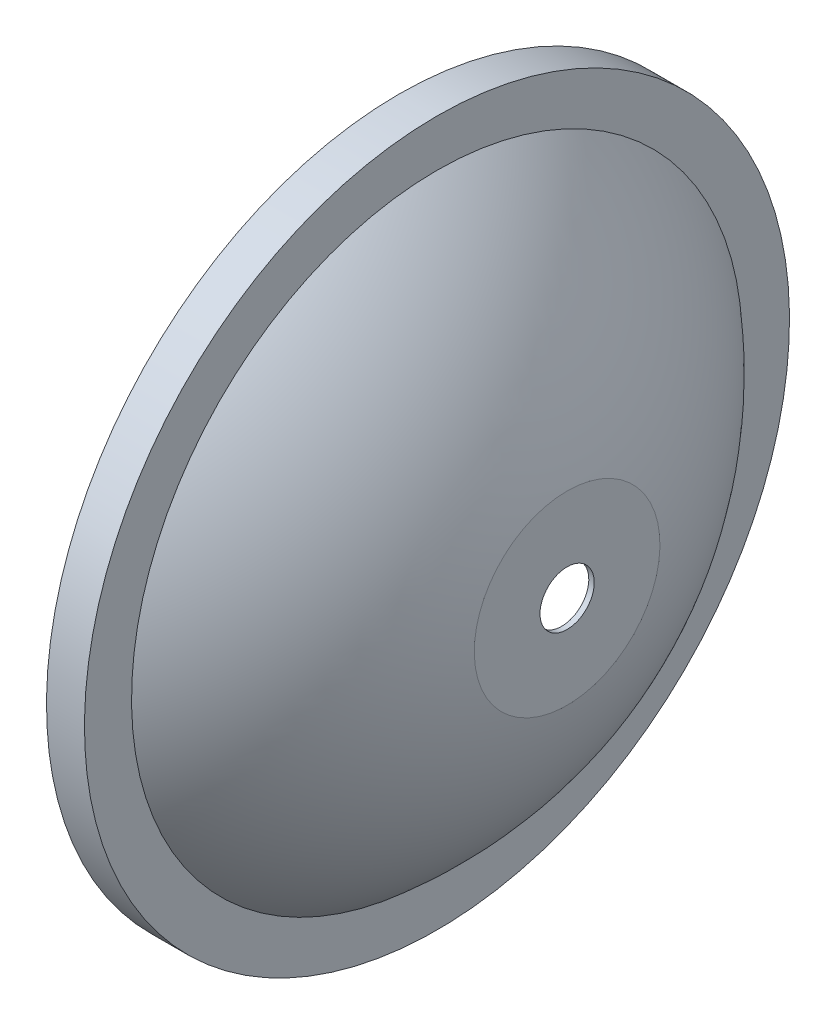
ISO-10303-21;
HEADER;
FILE_DESCRIPTION(('STEP AP214'),'2;1');
FILE_NAME('part.step','',(''),(''),'','','');
FILE_SCHEMA(('AUTOMOTIVE_DESIGN { 1 0 10303 214 1 1 1 1 }'));
ENDSEC;
DATA;
#1=APPLICATION_CONTEXT('core data for automotive mechanical design processes');
#2=APPLICATION_PROTOCOL_DEFINITION('international standard','automotive_design',2000,#1);
#3=PRODUCT_CONTEXT('',#1,'mechanical');
#4=PRODUCT('Part','Part','',(#3));
#5=PRODUCT_RELATED_PRODUCT_CATEGORY('part','',(#4));
#6=PRODUCT_DEFINITION_FORMATION('','',#4);
#7=PRODUCT_DEFINITION_CONTEXT('part definition',#1,'design');
#8=PRODUCT_DEFINITION('design','',#6,#7);
#9=PRODUCT_DEFINITION_SHAPE('','',#8);
#10=(LENGTH_UNIT() NAMED_UNIT(*) SI_UNIT(.MILLI.,.METRE.));
#11=(NAMED_UNIT(*) PLANE_ANGLE_UNIT() SI_UNIT($,.RADIAN.));
#12=(NAMED_UNIT(*) SI_UNIT($,.STERADIAN.) SOLID_ANGLE_UNIT());
#13=UNCERTAINTY_MEASURE_WITH_UNIT(LENGTH_MEASURE(1.E-05),#10,'distance_accuracy_value','');
#14=(GEOMETRIC_REPRESENTATION_CONTEXT(3) GLOBAL_UNCERTAINTY_ASSIGNED_CONTEXT((#13)) GLOBAL_UNIT_ASSIGNED_CONTEXT((#10,
#11,#12)) REPRESENTATION_CONTEXT('',''));
#15=CARTESIAN_POINT('',(0.,0.,0.));
#16=DIRECTION('',(0.,0.,1.));
#17=DIRECTION('',(1.,0.,0.));
#18=AXIS2_PLACEMENT_3D('',#15,#16,#17);
#19=CARTESIAN_POINT('',(36.0176991150443,0.,0.));
#20=DIRECTION('',(1.,0.,0.));
#21=DIRECTION('',(0.,1.,0.));
#22=AXIS2_PLACEMENT_3D('',#19,#20,#21);
#23=CYLINDRICAL_SURFACE('',#22,5.);
#24=CARTESIAN_POINT('',(1.,0.,0.));
#25=DIRECTION('',(1.,0.,0.));
#26=DIRECTION('',(0.,1.,0.));
#27=AXIS2_PLACEMENT_3D('',#24,#25,#26);
#28=CIRCLE('',#27,5.);
#29=CARTESIAN_POINT('',(1.,5.,0.));
#30=VERTEX_POINT('',#29);
#31=EDGE_CURVE('E71',#30,#30,#28,.T.);
#32=ORIENTED_EDGE('',*,*,#31,.T.);
#33=EDGE_LOOP('',(#32));
#34=FACE_BOUND('',#33,.T.);
#35=CARTESIAN_POINT('',(0.,0.,0.));
#36=DIRECTION('',(1.,0.,0.));
#37=DIRECTION('',(0.,1.,0.));
#38=AXIS2_PLACEMENT_3D('',#35,#36,#37);
#39=CIRCLE('',#38,5.);
#40=CARTESIAN_POINT('',(0.,5.,0.));
#41=VERTEX_POINT('',#40);
#42=EDGE_CURVE('E10',#41,#41,#39,.T.);
#43=ORIENTED_EDGE('',*,*,#42,.F.);
#44=EDGE_LOOP('',(#43));
#45=FACE_BOUND('',#44,.T.);
#46=ADVANCED_FACE('F37',(#34,#45),#23,.F.);
#47=CARTESIAN_POINT('',(0.,5.,0.));
#48=DIRECTION('',(-1.,0.,0.));
#49=DIRECTION('',(0.,-1.,0.));
#50=AXIS2_PLACEMENT_3D('',#47,#48,#49);
#51=PLANE('',#50);
#52=ORIENTED_EDGE('',*,*,#42,.T.);
#53=EDGE_LOOP('',(#52));
#54=FACE_BOUND('',#53,.T.);
#55=CARTESIAN_POINT('',(0.,0.,0.));
#56=DIRECTION('',(1.,0.,0.));
#57=DIRECTION('',(0.,1.,0.));
#58=AXIS2_PLACEMENT_3D('',#55,#56,#57);
#59=CIRCLE('',#58,17.);
#60=CARTESIAN_POINT('',(0.,17.0000000000001,0.));
#61=VERTEX_POINT('',#60);
#62=EDGE_CURVE('E43',#61,#61,#59,.T.);
#63=ORIENTED_EDGE('',*,*,#62,.F.);
#64=EDGE_LOOP('',(#63));
#65=FACE_BOUND('',#64,.T.);
#66=ADVANCED_FACE('F89',(#54,#65),#51,.T.);
#67=CARTESIAN_POINT('',(-70.9929573971954,0.,0.));
#68=DIRECTION('',(1.,0.,0.));
#69=DIRECTION('',(0.,1.,0.));
#70=AXIS2_PLACEMENT_3D('',#67,#68,#69);
#71=SPHERICAL_SURFACE('',#70,73.);
#72=CARTESIAN_POINT('',(-23.9929573971954,0.,0.));
#73=DIRECTION('',(1.,0.,0.));
#74=DIRECTION('',(0.,1.,0.));
#75=AXIS2_PLACEMENT_3D('',#72,#73,#74);
#76=CIRCLE('',#75,55.8569601750758);
#77=CARTESIAN_POINT('',(-23.9929573971954,55.8569601750758,0.));
#78=VERTEX_POINT('',#77);
#79=EDGE_CURVE('E47',#78,#78,#76,.T.);
#80=CARTESIAN_POINT('',(0.,17.0000000000001,0.));
#81=CARTESIAN_POINT('',(-0.112670572638903,17.4705215884803,0.));
#82=CARTESIAN_POINT('',(-0.230020169997372,17.9399227117788,0.));
#83=CARTESIAN_POINT('',(-0.474028120365013,18.8762992173913,0.));
#84=CARTESIAN_POINT('',(-0.600686473374186,19.3432745997055,0.));
#85=CARTESIAN_POINT('',(-0.86326264125478,20.2746148127285,0.));
#86=CARTESIAN_POINT('',(-0.999180456126203,20.7389796434375,0.));
#87=CARTESIAN_POINT('',(-1.28022160737407,21.6649152316036,0.));
#88=CARTESIAN_POINT('',(-1.42534494375051,22.1264859890608,0.));
#89=CARTESIAN_POINT('',(-1.72473982267247,23.046650944799,0.));
#90=CARTESIAN_POINT('',(-1.87901136521798,23.5052451430801,0.));
#91=CARTESIAN_POINT('',(-2.19664165381389,24.4192756897043,0.));
#92=CARTESIAN_POINT('',(-2.36000039986429,24.8747120380475,0.));
#93=CARTESIAN_POINT('',(-2.69574051935864,25.7822468374743,0.));
#94=CARTESIAN_POINT('',(-2.86812189280259,26.2343452885578,0.));
#95=CARTESIAN_POINT('',(-3.22183911900181,27.135025567029,0.));
#96=CARTESIAN_POINT('',(-3.40317497175707,27.5836073944165,0.));
#97=CARTESIAN_POINT('',(-3.77472946991128,28.4770770889207,0.));
#98=CARTESIAN_POINT('',(-3.96494811531024,28.9219649560373,0.));
#99=CARTESIAN_POINT('',(-4.35419300011171,29.8078708538416,0.));
#100=CARTESIAN_POINT('',(-4.55321923951424,30.2488888845294,0.));
#101=CARTESIAN_POINT('',(-4.96000063190094,31.1268807631438,0.));
#102=CARTESIAN_POINT('',(-5.16775578488513,31.5638546110703,0.));
#103=CARTESIAN_POINT('',(-5.59191287321198,32.433585376611,0.));
#104=CARTESIAN_POINT('',(-5.80831480855464,32.8663422942252,0.));
#105=CARTESIAN_POINT('',(-6.24967991207593,33.7274681186547,0.));
#106=CARTESIAN_POINT('',(-6.47464308025456,34.1558370254699,0.));
#107=CARTESIAN_POINT('',(-6.93304171543703,35.0080174825144,0.));
#108=CARTESIAN_POINT('',(-7.16647718244087,35.4318290327437,0.));
#109=CARTESIAN_POINT('',(-7.6417281319352,36.2747272324751,0.));
#110=CARTESIAN_POINT('',(-7.88354361442568,36.6938138819772,0.));
#111=CARTESIAN_POINT('',(-8.37545899870836,37.527096603994,0.));
#112=CARTESIAN_POINT('',(-8.62555890050054,37.9412926765087,0.));
#113=CARTESIAN_POINT('',(-9.13394425214724,38.7646305016672,0.));
#114=CARTESIAN_POINT('',(-9.39222970200176,39.1737722543111,0.));
#115=CARTESIAN_POINT('',(-9.91688404256571,39.9868396949537,0.));
#116=CARTESIAN_POINT('',(-10.1832529332752,40.3907653829524,0.));
#117=CARTESIAN_POINT('',(-10.7239688527393,41.1932410115816,0.));
#118=CARTESIAN_POINT('',(-10.998315881494,41.591790952212,0.));
#119=CARTESIAN_POINT('',(-11.5548796202657,42.3833575285593,0.));
#120=CARTESIAN_POINT('',(-11.8370963302826,42.7763741642762,0.));
#121=CARTESIAN_POINT('',(-12.4092878636989,43.5567187607158,0.));
#122=CARTESIAN_POINT('',(-12.6992626870982,43.9440467214384,0.));
#123=CARTESIAN_POINT('',(-13.2868558124062,44.7128608466967,0.));
#124=CARTESIAN_POINT('',(-13.5844741143149,45.0943470112325,0.));
#125=CARTESIAN_POINT('',(-14.1872365401006,45.8513267323385,0.));
#126=CARTESIAN_POINT('',(-14.4923806639774,46.2268202889089,0.));
#127=CARTESIAN_POINT('',(-15.1100741019797,46.9716663513658,0.));
#128=CARTESIAN_POINT('',(-15.4226234161051,47.3410188572524,0.));
#129=CARTESIAN_POINT('',(-16.0550036754798,48.0734368032704,0.));
#130=CARTESIAN_POINT('',(-16.3748346207291,48.4365022434018,0.));
#131=CARTESIAN_POINT('',(-17.0216517043532,49.1562025285684,0.));
#132=CARTESIAN_POINT('',(-17.3486378427281,49.5128373736036,0.));
#133=CARTESIAN_POINT('',(-18.0096360468915,50.2195354803658,0.));
#134=CARTESIAN_POINT('',(-18.3436481126801,50.5695987420928,0.));
#135=CARTESIAN_POINT('',(-19.0185661249594,51.2630152959021,0.));
#136=CARTESIAN_POINT('',(-19.3594720714501,51.6063685879843,0.));
#137=CARTESIAN_POINT('',(-20.0480430860019,52.2862294540537,0.));
#138=CARTESIAN_POINT('',(-20.395708154063,52.6227370280408,0.));
#139=CARTESIAN_POINT('',(-21.0976599323541,53.2887734707984,0.));
#140=CARTESIAN_POINT('',(-21.4519466425842,53.6183023395688,0.));
#141=CARTESIAN_POINT('',(-22.1670017880072,54.2702509382611,0.));
#142=CARTESIAN_POINT('',(-22.5277702232,54.592670668183,0.));
#143=CARTESIAN_POINT('',(-23.2556456675121,55.230274132472,0.));
#144=CARTESIAN_POINT('',(-23.6227526766313,55.5454578668391,0.));
#145=CARTESIAN_POINT('',(-23.9929573971954,55.8569601750758,0.));
#146=B_SPLINE_CURVE_WITH_KNOTS('',3,(#80,#81,#82,#83,#84,#85,#86,#87,#88,#89,#90,#91,#92,#93,
#94,#95,#96,#97,#98,#99,#100,#101,#102,#103,#104,#105,#106,#107,#108,#109,#110,#111,#112,#113,
#114,#115,#116,#117,#118,#119,#120,#121,#122,#123,#124,#125,#126,#127,#128,#129,#130,#131,#132,
#133,#134,#135,#136,#137,#138,#139,#140,#141,#142,#143,#144,#145),.UNSPECIFIED.,.F.,.F.,(4,2,2,
2,2,2,2,2,2,2,2,2,2,2,2,2,2,2,2,2,2,2,2,2,2,2,2,2,2,2,2,2,4),(0.,1.45144668774807,
2.90289337549614,4.35434006324421,5.80578675099226,7.25723343874033,8.70868012648839,
10.1601268142365,11.6115735019845,13.0630201897326,14.5144668774807,15.9659135652287,
17.4173602529768,18.8688069407249,20.3202536284729,21.771700316221,23.2231470039691,
24.6745936917171,26.1260403794652,27.5774870672133,29.0289337549613,30.4803804427094,
31.9318271304575,33.3832738182055,34.8347205059536,36.2861671937017,37.7376138814497,
39.1890605691978,40.6405072569459,42.0919539446939,43.543400632442,44.9948473201901,
46.4462940079381),.UNSPECIFIED.);
#147=EDGE_CURVE('BSEAM93',#61,#78,#146,.T.);
#148=ORIENTED_EDGE('',*,*,#62,.T.);
#149=ORIENTED_EDGE('',*,*,#79,.F.);
#150=ORIENTED_EDGE('',*,*,#147,.T.);
#151=ORIENTED_EDGE('',*,*,#147,.F.);
#152=EDGE_LOOP('',(#148,#150,#149,#151));
#153=FACE_BOUND('',#152,.T.);
#154=ADVANCED_FACE('F93',(#153),#71,.F.);
#155=CARTESIAN_POINT('',(-23.9929573971954,55.8569601750758,0.));
#156=DIRECTION('',(-1.,0.,0.));
#157=DIRECTION('',(0.,-1.,0.));
#158=AXIS2_PLACEMENT_3D('',#155,#156,#157);
#159=PLANE('',#158);
#160=ORIENTED_EDGE('',*,*,#79,.T.);
#161=EDGE_LOOP('',(#160));
#162=FACE_BOUND('',#161,.T.);
#163=CARTESIAN_POINT('',(-23.9929573971954,0.,0.));
#164=DIRECTION('',(1.,0.,0.));
#165=DIRECTION('',(0.,1.,0.));
#166=AXIS2_PLACEMENT_3D('',#163,#164,#165);
#167=CIRCLE('',#166,64.);
#168=CARTESIAN_POINT('',(-23.9929573971954,64.,0.));
#169=VERTEX_POINT('',#168);
#170=EDGE_CURVE('E51',#169,#169,#167,.T.);
#171=ORIENTED_EDGE('',*,*,#170,.F.);
#172=EDGE_LOOP('',(#171));
#173=FACE_BOUND('',#172,.T.);
#174=ADVANCED_FACE('F97',(#162,#173),#159,.T.);
#175=CARTESIAN_POINT('',(36.0176991150443,0.,0.));
#176=DIRECTION('',(1.,0.,0.));
#177=DIRECTION('',(0.,1.,0.));
#178=AXIS2_PLACEMENT_3D('',#175,#176,#177);
#179=CYLINDRICAL_SURFACE('',#178,64.);
#180=ORIENTED_EDGE('',*,*,#170,.T.);
#181=EDGE_LOOP('',(#180));
#182=FACE_BOUND('',#181,.T.);
#183=CARTESIAN_POINT('',(-29.9929573971954,0.,0.));
#184=DIRECTION('',(1.,0.,0.));
#185=DIRECTION('',(0.,1.,0.));
#186=AXIS2_PLACEMENT_3D('',#183,#184,#185);
#187=CIRCLE('',#186,64.);
#188=CARTESIAN_POINT('',(-29.9929573971954,64.,0.));
#189=VERTEX_POINT('',#188);
#190=EDGE_CURVE('E56',#189,#189,#187,.T.);
#191=ORIENTED_EDGE('',*,*,#190,.F.);
#192=EDGE_LOOP('',(#191));
#193=FACE_BOUND('',#192,.T.);
#194=ADVANCED_FACE('F103',(#182,#193),#179,.F.);
#195=CARTESIAN_POINT('',(-29.9929573971954,65.,0.));
#196=DIRECTION('',(-1.,0.,0.));
#197=DIRECTION('',(0.,-1.,0.));
#198=AXIS2_PLACEMENT_3D('',#195,#196,#197);
#199=PLANE('',#198);
#200=ORIENTED_EDGE('',*,*,#190,.T.);
#201=EDGE_LOOP('',(#200));
#202=FACE_BOUND('',#201,.T.);
#203=CARTESIAN_POINT('',(-29.9929573971954,0.,0.));
#204=DIRECTION('',(1.,0.,0.));
#205=DIRECTION('',(0.,1.,0.));
#206=AXIS2_PLACEMENT_3D('',#203,#204,#205);
#207=CIRCLE('',#206,65.);
#208=CARTESIAN_POINT('',(-29.9929573971954,65.,0.));
#209=VERTEX_POINT('',#208);
#210=EDGE_CURVE('E59',#209,#209,#207,.T.);
#211=ORIENTED_EDGE('',*,*,#210,.F.);
#212=EDGE_LOOP('',(#211));
#213=FACE_BOUND('',#212,.T.);
#214=ADVANCED_FACE('F107',(#202,#213),#199,.T.);
#215=CARTESIAN_POINT('',(36.0176991150443,0.,0.));
#216=DIRECTION('',(1.,0.,0.));
#217=DIRECTION('',(0.,1.,0.));
#218=AXIS2_PLACEMENT_3D('',#215,#216,#217);
#219=CYLINDRICAL_SURFACE('',#218,65.);
#220=ORIENTED_EDGE('',*,*,#210,.T.);
#221=EDGE_LOOP('',(#220));
#222=FACE_BOUND('',#221,.T.);
#223=CARTESIAN_POINT('',(-22.9929573971954,0.,0.));
#224=DIRECTION('',(1.,0.,0.));
#225=DIRECTION('',(0.,1.,0.));
#226=AXIS2_PLACEMENT_3D('',#223,#224,#225);
#227=CIRCLE('',#226,65.);
#228=CARTESIAN_POINT('',(-22.9929573971954,65.,0.));
#229=VERTEX_POINT('',#228);
#230=EDGE_CURVE('E62',#229,#229,#227,.T.);
#231=ORIENTED_EDGE('',*,*,#230,.F.);
#232=EDGE_LOOP('',(#231));
#233=FACE_BOUND('',#232,.T.);
#234=ADVANCED_FACE('F111',(#222,#233),#219,.T.);
#235=CARTESIAN_POINT('',(-22.9929573971954,56.3205113613149,0.));
#236=DIRECTION('',(1.,0.,0.));
#237=DIRECTION('',(0.,1.,0.));
#238=AXIS2_PLACEMENT_3D('',#235,#236,#237);
#239=PLANE('',#238);
#240=ORIENTED_EDGE('',*,*,#230,.T.);
#241=EDGE_LOOP('',(#240));
#242=FACE_BOUND('',#241,.T.);
#243=CARTESIAN_POINT('',(-22.9929573971954,0.,0.));
#244=DIRECTION('',(1.,0.,0.));
#245=DIRECTION('',(0.,1.,0.));
#246=AXIS2_PLACEMENT_3D('',#243,#244,#245);
#247=CIRCLE('',#246,56.3205113613149);
#248=CARTESIAN_POINT('',(-22.9929573971954,56.3205113613149,0.));
#249=VERTEX_POINT('',#248);
#250=EDGE_CURVE('E65',#249,#249,#247,.T.);
#251=ORIENTED_EDGE('',*,*,#250,.F.);
#252=EDGE_LOOP('',(#251));
#253=FACE_BOUND('',#252,.T.);
#254=ADVANCED_FACE('F85',(#242,#253),#239,.T.);
#255=CARTESIAN_POINT('',(-70.9929573971954,0.,0.));
#256=DIRECTION('',(1.,0.,0.));
#257=DIRECTION('',(0.,1.,0.));
#258=AXIS2_PLACEMENT_3D('',#255,#256,#257);
#259=SPHERICAL_SURFACE('',#258,74.);
#260=CARTESIAN_POINT('',(1.,0.,0.));
#261=DIRECTION('',(1.,0.,0.));
#262=DIRECTION('',(0.,1.,0.));
#263=AXIS2_PLACEMENT_3D('',#260,#261,#262);
#264=CIRCLE('',#263,17.1176541969281);
#265=CARTESIAN_POINT('',(0.999999999999987,17.1176541969281,0.));
#266=VERTEX_POINT('',#265);
#267=EDGE_CURVE('E68',#266,#266,#264,.T.);
#268=CARTESIAN_POINT('',(-22.9929573971954,56.3205113613149,0.));
#269=CARTESIAN_POINT('',(-22.6224413895323,56.0047344228491,0.));
#270=CARTESIAN_POINT('',(-22.2550423613412,55.6853002306746,0.));
#271=CARTESIAN_POINT('',(-21.5266194076841,55.0392439667615,0.));
#272=CARTESIAN_POINT('',(-21.1655954822181,54.7126218950229,0.));
#273=CARTESIAN_POINT('',(-20.4500638777919,54.0523164998345,0.));
#274=CARTESIAN_POINT('',(-20.0955561988317,53.7186331763848,0.));
#275=CARTESIAN_POINT('',(-19.39319502777,53.0443354061621,0.));
#276=CARTESIAN_POINT('',(-19.0453415356683,52.7037209593891,0.));
#277=CARTESIAN_POINT('',(-18.3564242651454,52.0156935695762,0.));
#278=CARTESIAN_POINT('',(-18.015360486724,51.6682806265364,0.));
#279=CARTESIAN_POINT('',(-17.3401554780161,50.9667915731246,0.));
#280=CARTESIAN_POINT('',(-17.0060142477294,50.6127154627527,0.));
#281=CARTESIAN_POINT('',(-16.3447844862085,49.8980379844877,0.));
#282=CARTESIAN_POINT('',(-16.0176959549742,49.5374366165945,0.));
#283=CARTESIAN_POINT('',(-15.3706989920152,48.8098490785565,0.));
#284=CARTESIAN_POINT('',(-15.0507905602904,48.4428629084116,0.));
#285=CARTESIAN_POINT('',(-14.4182784010738,47.702648706988,0.));
#286=CARTESIAN_POINT('',(-14.1056746735818,47.3294206757092,0.));
#287=CARTESIAN_POINT('',(-13.4878936821208,46.5768681246217,0.));
#288=CARTESIAN_POINT('',(-13.1827164181518,46.1975436048131,0.));
#289=CARTESIAN_POINT('',(-12.5799072204807,45.4329458237818,0.));
#290=CARTESIAN_POINT('',(-12.2822752867787,45.047672562559,0.));
#291=CARTESIAN_POINT('',(-11.6946726774573,44.2713273628735,0.));
#292=CARTESIAN_POINT('',(-11.4047020018379,43.8802554244107,0.));
#293=CARTESIAN_POINT('',(-10.8325348524376,43.0924651930022,0.));
#294=CARTESIAN_POINT('',(-10.5503383786566,42.6957469000563,0.));
#295=CARTESIAN_POINT('',(-9.9938295486312,41.8968184816987,0.));
#296=CARTESIAN_POINT('',(-9.71951719238672,41.4946083562868,0.));
#297=CARTESIAN_POINT('',(-9.17888344226412,40.6848529340857,0.));
#298=CARTESIAN_POINT('',(-8.912562048386,40.2773076372964,0.));
#299=CARTESIAN_POINT('',(-8.38801395534115,39.4570406114818,0.));
#300=CARTESIAN_POINT('',(-8.12978725617442,39.0443188824564,0.));
#301=CARTESIAN_POINT('',(-7.62152913200895,38.2138597475343,0.));
#302=CARTESIAN_POINT('',(-7.37149770701021,37.7961223416375,0.));
#303=CARTESIAN_POINT('',(-6.87972751857298,36.9557945619467,0.));
#304=CARTESIAN_POINT('',(-6.63798875513448,36.5332041881525,0.));
#305=CARTESIAN_POINT('',(-6.16289804721331,35.6833350718748,0.));
#306=CARTESIAN_POINT('',(-5.92954610273065,35.2560563293912,0.));
#307=CARTESIAN_POINT('',(-5.4713199234455,34.3969769010648,0.));
#308=CARTESIAN_POINT('',(-5.24644568864302,33.9651762152221,0.));
#309=CARTESIAN_POINT('',(-4.80526251737002,33.0972210868075,0.));
#310=CARTESIAN_POINT('',(-4.58895358089949,32.6610666442356,0.));
#311=CARTESIAN_POINT('',(-4.16498525875143,31.7845738847841,0.));
#312=CARTESIAN_POINT('',(-3.95732587307388,31.3442355679044,0.));
#313=CARTESIAN_POINT('',(-3.55073753597437,30.4595465718783,0.));
#314=CARTESIAN_POINT('',(-3.3518085845524,30.015195892732,0.));
#315=CARTESIAN_POINT('',(-2.96275859889141,29.122655247038,0.));
#316=CARTESIAN_POINT('',(-2.7726375646524,28.6744652804903,0.));
#317=CARTESIAN_POINT('',(-2.40127746569183,27.7744206302389,0.));
#318=CARTESIAN_POINT('',(-2.22003840097028,27.3225659465352,0.));
#319=CARTESIAN_POINT('',(-1.86651283348737,26.4153678597193,0.));
#320=CARTESIAN_POINT('',(-1.69422633072601,25.9600244566072,0.));
#321=CARTESIAN_POINT('',(-1.35867299391869,25.0460262872339,0.));
#322=CARTESIAN_POINT('',(-1.19540615987271,24.5873715209726,0.));
#323=CARTESIAN_POINT('',(-0.87795574908089,23.6669292726328,0.));
#324=CARTESIAN_POINT('',(-0.72377217233504,23.2051417905541,0.));
#325=CARTESIAN_POINT('',(-0.424548345469213,22.2786139732744,0.));
#326=CARTESIAN_POINT('',(-0.279508095349236,21.8138736380732,0.));
#327=CARTESIAN_POINT('',(0.00137263996749168,20.8816211454133,0.));
#328=CARTESIAN_POINT('',(0.137213125164244,20.4141089879546,0.));
#329=CARTESIAN_POINT('',(0.399641215538031,19.4764948939744,0.));
#330=CARTESIAN_POINT('',(0.526228820715067,19.0063929574528,0.));
#331=CARTESIAN_POINT('',(0.770102610710868,18.0637826084173,0.));
#332=CARTESIAN_POINT('',(0.887388795529634,17.5912741959032,0.));
#333=CARTESIAN_POINT('',(0.999999999999987,17.1176541969281,0.));
#334=B_SPLINE_CURVE_WITH_KNOTS('',3,(#268,#269,#270,#271,#272,#273,#274,#275,#276,#277,#278,
#279,#280,#281,#282,#283,#284,#285,#286,#287,#288,#289,#290,#291,#292,#293,#294,#295,#296,#297,
#298,#299,#300,#301,#302,#303,#304,#305,#306,#307,#308,#309,#310,#311,#312,#313,#314,#315,#316,
#317,#318,#319,#320,#321,#322,#323,#324,#325,#326,#327,#328,#329,#330,#331,#332,#333),
.UNSPECIFIED.,.F.,.F.,(4,2,2,2,2,2,2,2,2,2,2,2,2,2,2,2,2,2,2,2,2,2,2,2,2,2,2,2,2,2,2,2,4),(0.,
1.46044696389162,2.92089392778323,4.38134089167485,5.84178785556647,7.30223481945809,
8.7626817833497,10.2231287472413,11.6835757111329,13.1440226750246,14.6044696389162,
16.0649166028078,17.5253635666994,18.9858105305911,20.4462574944827,21.9067044583743,
23.3671514222659,24.8275983861575,26.2880453500492,27.7484923139408,29.2089392778324,
30.669386241724,32.1298332056156,33.5902801695072,35.0507271333989,36.5111740972905,
37.9716210611821,39.4320680250737,40.8925149889653,42.352961952857,43.8134089167486,
45.2738558806402,46.7343028445318),.UNSPECIFIED.);
#335=EDGE_CURVE('BSEAM79',#249,#266,#334,.T.);
#336=ORIENTED_EDGE('',*,*,#250,.T.);
#337=ORIENTED_EDGE('',*,*,#267,.F.);
#338=ORIENTED_EDGE('',*,*,#335,.T.);
#339=ORIENTED_EDGE('',*,*,#335,.F.);
#340=EDGE_LOOP('',(#336,#338,#337,#339));
#341=FACE_BOUND('',#340,.T.);
#342=ADVANCED_FACE('F79',(#341),#259,.T.);
#343=CARTESIAN_POINT('',(1.,5.,0.));
#344=DIRECTION('',(1.,0.,0.));
#345=DIRECTION('',(0.,1.,0.));
#346=AXIS2_PLACEMENT_3D('',#343,#344,#345);
#347=PLANE('',#346);
#348=ORIENTED_EDGE('',*,*,#267,.T.);
#349=EDGE_LOOP('',(#348));
#350=FACE_BOUND('',#349,.T.);
#351=ORIENTED_EDGE('',*,*,#31,.F.);
#352=EDGE_LOOP('',(#351));
#353=FACE_BOUND('',#352,.T.);
#354=ADVANCED_FACE('F77',(#350,#353),#347,.T.);
#355=CLOSED_SHELL('',(#46,#66,#154,#174,#194,#214,#234,#254,#342,#354));
#356=MANIFOLD_SOLID_BREP('B2',#355);
#357=ADVANCED_BREP_SHAPE_REPRESENTATION('',(#18,#356),#14);
#358=SHAPE_DEFINITION_REPRESENTATION(#9,#357);
ENDSEC;
END-ISO-10303-21;
